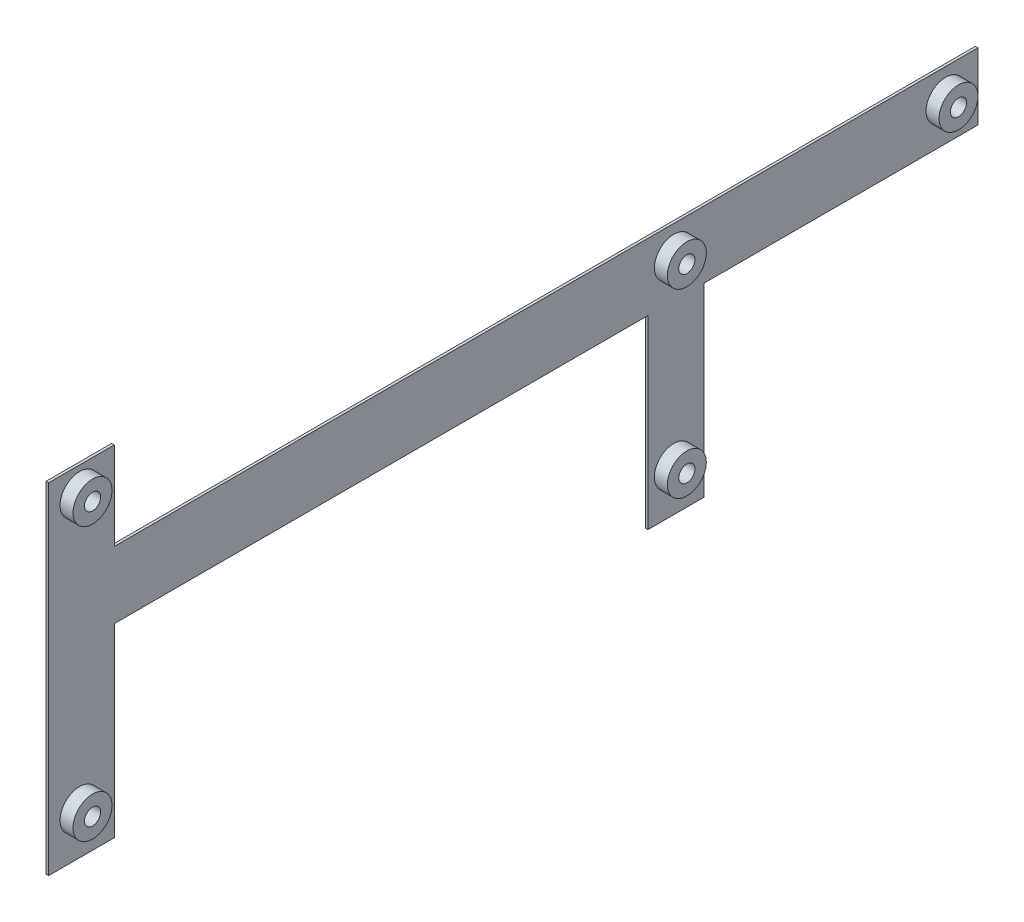
ISO-10303-21;
HEADER;
FILE_DESCRIPTION(('STEP AP214'),'2;1');
FILE_NAME('part.step','',(''),(''),'','','');
FILE_SCHEMA(('AUTOMOTIVE_DESIGN { 1 0 10303 214 1 1 1 1 }'));
ENDSEC;
DATA;
#1=APPLICATION_CONTEXT('core data for automotive mechanical design processes');
#2=APPLICATION_PROTOCOL_DEFINITION('international standard','automotive_design',2000,#1);
#3=PRODUCT_CONTEXT('',#1,'mechanical');
#4=PRODUCT('Part','Part','',(#3));
#5=PRODUCT_RELATED_PRODUCT_CATEGORY('part','',(#4));
#6=PRODUCT_DEFINITION_FORMATION('','',#4);
#7=PRODUCT_DEFINITION_CONTEXT('part definition',#1,'design');
#8=PRODUCT_DEFINITION('design','',#6,#7);
#9=PRODUCT_DEFINITION_SHAPE('','',#8);
#10=(LENGTH_UNIT() NAMED_UNIT(*) SI_UNIT(.MILLI.,.METRE.));
#11=(NAMED_UNIT(*) PLANE_ANGLE_UNIT() SI_UNIT($,.RADIAN.));
#12=(NAMED_UNIT(*) SI_UNIT($,.STERADIAN.) SOLID_ANGLE_UNIT());
#13=UNCERTAINTY_MEASURE_WITH_UNIT(LENGTH_MEASURE(1.E-05),#10,'distance_accuracy_value','');
#14=(GEOMETRIC_REPRESENTATION_CONTEXT(3) GLOBAL_UNCERTAINTY_ASSIGNED_CONTEXT((#13)) GLOBAL_UNIT_ASSIGNED_CONTEXT((#10,
#11,#12)) REPRESENTATION_CONTEXT('',''));
#15=CARTESIAN_POINT('',(0.,0.,0.));
#16=DIRECTION('',(0.,0.,1.));
#17=DIRECTION('',(1.,0.,0.));
#18=AXIS2_PLACEMENT_3D('',#15,#16,#17);
#19=CARTESIAN_POINT('',(0.,1.,163.444017334985));
#20=DIRECTION('',(0.,-1.,0.));
#21=DIRECTION('',(0.,0.,-1.));
#22=AXIS2_PLACEMENT_3D('',#19,#20,#21);
#23=PLANE('',#22);
#24=DIRECTION('',(1.,0.,0.));
#25=VECTOR('',#24,1.);
#26=CARTESIAN_POINT('',(0.,1.,163.444017334985));
#27=LINE('',#26,#25);
#28=CARTESIAN_POINT('',(0.6,1.,163.444017334985));
#29=VERTEX_POINT('',#28);
#30=CARTESIAN_POINT('',(1.,1.,163.444017334985));
#31=VERTEX_POINT('',#30);
#32=EDGE_CURVE('E166',#29,#31,#27,.T.);
#33=ORIENTED_EDGE('',*,*,#32,.F.);
#34=DIRECTION('',(0.,0.,-1.));
#35=VECTOR('',#34,1.);
#36=CARTESIAN_POINT('',(0.6,1.,163.444017334985));
#37=LINE('',#36,#35);
#38=CARTESIAN_POINT('',(0.6,1.,153.329552236333));
#39=VERTEX_POINT('',#38);
#40=EDGE_CURVE('E277',#29,#39,#37,.T.);
#41=ORIENTED_EDGE('',*,*,#40,.T.);
#42=DIRECTION('',(1.,0.,0.));
#43=VECTOR('',#42,1.);
#44=CARTESIAN_POINT('',(-9.,1.,153.329552236333));
#45=LINE('',#44,#43);
#46=CARTESIAN_POINT('',(1.,1.,153.329552236333));
#47=VERTEX_POINT('',#46);
#48=EDGE_CURVE('E163',#39,#47,#45,.T.);
#49=ORIENTED_EDGE('',*,*,#48,.T.);
#50=DIRECTION('',(0.,0.,1.));
#51=VECTOR('',#50,1.);
#52=CARTESIAN_POINT('',(1.,1.,325.));
#53=LINE('',#52,#51);
#54=EDGE_CURVE('E173',#47,#31,#53,.T.);
#55=ORIENTED_EDGE('',*,*,#54,.T.);
#56=EDGE_LOOP('',(#33,#41,#49,#55));
#57=FACE_BOUND('',#56,.T.);
#58=ADVANCED_FACE('F39',(#57),#23,.T.);
#59=CARTESIAN_POINT('',(0.,53.3864437081917,163.444017334985));
#60=DIRECTION('',(0.,0.,1.));
#61=DIRECTION('',(1.,0.,0.));
#62=AXIS2_PLACEMENT_3D('',#59,#60,#61);
#63=PLANE('',#62);
#64=DIRECTION('',(1.,0.,0.));
#65=VECTOR('',#64,1.);
#66=CARTESIAN_POINT('',(0.,53.3864437081917,163.444017334985));
#67=LINE('',#66,#65);
#68=CARTESIAN_POINT('',(0.6,53.3864437081917,163.444017334985));
#69=VERTEX_POINT('',#68);
#70=CARTESIAN_POINT('',(1.,53.3864437081917,163.444017334985));
#71=VERTEX_POINT('',#70);
#72=EDGE_CURVE('E60',#69,#71,#67,.T.);
#73=ORIENTED_EDGE('',*,*,#72,.F.);
#74=DIRECTION('',(0.,-1.,0.));
#75=VECTOR('',#74,1.);
#76=CARTESIAN_POINT('',(0.6,53.3864437081917,163.444017334985));
#77=LINE('',#76,#75);
#78=EDGE_CURVE('E272',#69,#29,#77,.T.);
#79=ORIENTED_EDGE('',*,*,#78,.T.);
#80=ORIENTED_EDGE('',*,*,#32,.T.);
#81=DIRECTION('',(0.,1.,0.));
#82=VECTOR('',#81,1.);
#83=CARTESIAN_POINT('',(1.,0.,163.444017334985));
#84=LINE('',#83,#82);
#85=EDGE_CURVE('E183',#31,#71,#84,.T.);
#86=ORIENTED_EDGE('',*,*,#85,.T.);
#87=EDGE_LOOP('',(#73,#79,#80,#86));
#88=FACE_BOUND('',#87,.T.);
#89=ADVANCED_FACE('F314',(#88),#63,.T.);
#90=CARTESIAN_POINT('',(0.,53.3864437081917,163.444017334985));
#91=DIRECTION('',(0.,1.,0.));
#92=DIRECTION('',(0.,0.,1.));
#93=AXIS2_PLACEMENT_3D('',#90,#91,#92);
#94=PLANE('',#93);
#95=DIRECTION('',(1.,0.,0.));
#96=VECTOR('',#95,1.);
#97=CARTESIAN_POINT('',(-9.,53.3864437081917,153.329552236333));
#98=LINE('',#97,#96);
#99=CARTESIAN_POINT('',(0.6,53.3864437081917,153.329552236333));
#100=VERTEX_POINT('',#99);
#101=CARTESIAN_POINT('',(1.,53.3864437081917,153.329552236333));
#102=VERTEX_POINT('',#101);
#103=EDGE_CURVE('E145',#100,#102,#98,.T.);
#104=ORIENTED_EDGE('',*,*,#103,.F.);
#105=DIRECTION('',(0.,0.,1.));
#106=VECTOR('',#105,1.);
#107=CARTESIAN_POINT('',(0.6,53.3864437081917,163.444017334985));
#108=LINE('',#107,#106);
#109=EDGE_CURVE('E53',#100,#69,#108,.T.);
#110=ORIENTED_EDGE('',*,*,#109,.T.);
#111=ORIENTED_EDGE('',*,*,#72,.T.);
#112=DIRECTION('',(0.,0.,-1.));
#113=VECTOR('',#112,1.);
#114=CARTESIAN_POINT('',(1.,53.3864437081917,325.));
#115=LINE('',#114,#113);
#116=EDGE_CURVE('E181',#71,#102,#115,.T.);
#117=ORIENTED_EDGE('',*,*,#116,.T.);
#118=EDGE_LOOP('',(#104,#110,#111,#117));
#119=FACE_BOUND('',#118,.T.);
#120=ADVANCED_FACE('F316',(#119),#94,.T.);
#121=CARTESIAN_POINT('',(0.,53.3864437081917,20.3685065016627));
#122=DIRECTION('',(0.,0.,-1.));
#123=DIRECTION('',(-1.,0.,0.));
#124=AXIS2_PLACEMENT_3D('',#121,#122,#123);
#125=PLANE('',#124);
#126=DIRECTION('',(1.,0.,0.));
#127=VECTOR('',#126,1.);
#128=CARTESIAN_POINT('',(-9.,29.5458737606863,20.3685065016627));
#129=LINE('',#128,#127);
#130=CARTESIAN_POINT('',(0.6,29.5458737606863,20.3685065016627));
#131=VERTEX_POINT('',#130);
#132=CARTESIAN_POINT('',(1.,29.5458737606863,20.3685065016627));
#133=VERTEX_POINT('',#132);
#134=EDGE_CURVE('E260',#131,#133,#129,.T.);
#135=ORIENTED_EDGE('',*,*,#134,.F.);
#136=DIRECTION('',(0.,1.,0.));
#137=VECTOR('',#136,1.);
#138=CARTESIAN_POINT('',(0.6,53.3864437081917,20.3685065016627));
#139=LINE('',#138,#137);
#140=CARTESIAN_POINT('',(0.6,39.8466740003524,20.3685065016627));
#141=VERTEX_POINT('',#140);
#142=EDGE_CURVE('E139',#131,#141,#139,.T.);
#143=ORIENTED_EDGE('',*,*,#142,.T.);
#144=DIRECTION('',(1.,0.,0.));
#145=VECTOR('',#144,1.);
#146=CARTESIAN_POINT('',(-9.,39.8466740003524,20.3685065016627));
#147=LINE('',#146,#145);
#148=CARTESIAN_POINT('',(1.,39.8466740003524,20.3685065016627));
#149=VERTEX_POINT('',#148);
#150=EDGE_CURVE('E138',#141,#149,#147,.T.);
#151=ORIENTED_EDGE('',*,*,#150,.T.);
#152=DIRECTION('',(0.,-1.,0.));
#153=VECTOR('',#152,1.);
#154=CARTESIAN_POINT('',(1.,0.,20.3685065016627));
#155=LINE('',#154,#153);
#156=EDGE_CURVE('E178',#149,#133,#155,.T.);
#157=ORIENTED_EDGE('',*,*,#156,.T.);
#158=EDGE_LOOP('',(#135,#143,#151,#157));
#159=FACE_BOUND('',#158,.T.);
#160=ADVANCED_FACE('F269',(#159),#125,.T.);
#161=DIRECTION('',(1.,0.,0.));
#162=VECTOR('',#161,1.);
#163=CARTESIAN_POINT('',(-9.,1.,71.1774910656624));
#164=LINE('',#163,#162);
#165=CARTESIAN_POINT('',(0.6,1.,71.1774910656624));
#166=VERTEX_POINT('',#165);
#167=CARTESIAN_POINT('',(1.,1.,71.1774910656624));
#168=VERTEX_POINT('',#167);
#169=EDGE_CURVE('E169',#166,#168,#164,.T.);
#170=ORIENTED_EDGE('',*,*,#169,.F.);
#171=DIRECTION('',(0.,0.,-1.));
#172=VECTOR('',#171,1.);
#173=CARTESIAN_POINT('',(0.6,1.,163.444017334985));
#174=LINE('',#173,#172);
#175=CARTESIAN_POINT('',(0.6,1.,62.529905679276));
#176=VERTEX_POINT('',#175);
#177=EDGE_CURVE('E226',#166,#176,#174,.T.);
#178=ORIENTED_EDGE('',*,*,#177,.T.);
#179=DIRECTION('',(1.,0.,0.));
#180=VECTOR('',#179,1.);
#181=CARTESIAN_POINT('',(-9.,1.,62.529905679276));
#182=LINE('',#181,#180);
#183=CARTESIAN_POINT('',(1.,1.,62.529905679276));
#184=VERTEX_POINT('',#183);
#185=EDGE_CURVE('E258',#176,#184,#182,.T.);
#186=ORIENTED_EDGE('',*,*,#185,.T.);
#187=EDGE_CURVE('E177',#184,#168,#53,.T.);
#188=ORIENTED_EDGE('',*,*,#187,.T.);
#189=EDGE_LOOP('',(#170,#178,#186,#188));
#190=FACE_BOUND('',#189,.T.);
#191=ADVANCED_FACE('F289',(#190),#23,.T.);
#192=CARTESIAN_POINT('',(-9.,1.,153.329552236333));
#193=DIRECTION('',(0.,0.,1.));
#194=DIRECTION('',(1.,0.,0.));
#195=AXIS2_PLACEMENT_3D('',#192,#193,#194);
#196=PLANE('',#195);
#197=DIRECTION('',(0.,-1.,0.));
#198=VECTOR('',#197,1.);
#199=CARTESIAN_POINT('',(0.6,1.,153.329552236333));
#200=LINE('',#199,#198);
#201=CARTESIAN_POINT('',(0.6,29.5458737606863,153.329552236333));
#202=VERTEX_POINT('',#201);
#203=EDGE_CURVE('E284',#202,#39,#200,.T.);
#204=ORIENTED_EDGE('',*,*,#203,.F.);
#205=DIRECTION('',(1.,0.,0.));
#206=VECTOR('',#205,1.);
#207=CARTESIAN_POINT('',(-9.,29.5458737606863,153.329552236333));
#208=LINE('',#207,#206);
#209=CARTESIAN_POINT('',(1.,29.5458737606863,153.329552236333));
#210=VERTEX_POINT('',#209);
#211=EDGE_CURVE('E164',#202,#210,#208,.T.);
#212=ORIENTED_EDGE('',*,*,#211,.T.);
#213=DIRECTION('',(0.,-1.,0.));
#214=VECTOR('',#213,1.);
#215=CARTESIAN_POINT('',(1.,1.,153.329552236333));
#216=LINE('',#215,#214);
#217=EDGE_CURVE('E153',#210,#47,#216,.T.);
#218=ORIENTED_EDGE('',*,*,#217,.T.);
#219=ORIENTED_EDGE('',*,*,#48,.F.);
#220=EDGE_LOOP('',(#204,#212,#218,#219));
#221=FACE_BOUND('',#220,.T.);
#222=ADVANCED_FACE('F307',(#221),#196,.F.);
#223=CARTESIAN_POINT('',(-9.,29.5458737606863,153.329552236333));
#224=DIRECTION('',(0.,1.,0.));
#225=DIRECTION('',(0.,0.,1.));
#226=AXIS2_PLACEMENT_3D('',#223,#224,#225);
#227=PLANE('',#226);
#228=DIRECTION('',(0.,0.,1.));
#229=VECTOR('',#228,1.);
#230=CARTESIAN_POINT('',(0.6,29.5458737606863,153.329552236333));
#231=LINE('',#230,#229);
#232=CARTESIAN_POINT('',(0.6,29.5458737606863,71.1774910656624));
#233=VERTEX_POINT('',#232);
#234=EDGE_CURVE('E216',#233,#202,#231,.T.);
#235=ORIENTED_EDGE('',*,*,#234,.F.);
#236=DIRECTION('',(1.,0.,0.));
#237=VECTOR('',#236,1.);
#238=CARTESIAN_POINT('',(-9.,29.5458737606863,71.1774910656624));
#239=LINE('',#238,#237);
#240=CARTESIAN_POINT('',(1.,29.5458737606863,71.1774910656624));
#241=VERTEX_POINT('',#240);
#242=EDGE_CURVE('E167',#233,#241,#239,.T.);
#243=ORIENTED_EDGE('',*,*,#242,.T.);
#244=DIRECTION('',(0.,0.,1.));
#245=VECTOR('',#244,1.);
#246=CARTESIAN_POINT('',(1.,29.5458737606863,153.329552236333));
#247=LINE('',#246,#245);
#248=EDGE_CURVE('E160',#241,#210,#247,.T.);
#249=ORIENTED_EDGE('',*,*,#248,.T.);
#250=ORIENTED_EDGE('',*,*,#211,.F.);
#251=EDGE_LOOP('',(#235,#243,#249,#250));
#252=FACE_BOUND('',#251,.T.);
#253=ADVANCED_FACE('F305',(#252),#227,.F.);
#254=CARTESIAN_POINT('',(-9.,1.,71.1774910656624));
#255=DIRECTION('',(0.,0.,-1.));
#256=DIRECTION('',(-1.,0.,0.));
#257=AXIS2_PLACEMENT_3D('',#254,#255,#256);
#258=PLANE('',#257);
#259=DIRECTION('',(0.,1.,0.));
#260=VECTOR('',#259,1.);
#261=CARTESIAN_POINT('',(0.6,1.,71.1774910656624));
#262=LINE('',#261,#260);
#263=EDGE_CURVE('E222',#166,#233,#262,.T.);
#264=ORIENTED_EDGE('',*,*,#263,.F.);
#265=ORIENTED_EDGE('',*,*,#169,.T.);
#266=DIRECTION('',(0.,1.,0.));
#267=VECTOR('',#266,1.);
#268=CARTESIAN_POINT('',(1.,1.,71.1774910656624));
#269=LINE('',#268,#267);
#270=EDGE_CURVE('E156',#168,#241,#269,.T.);
#271=ORIENTED_EDGE('',*,*,#270,.T.);
#272=ORIENTED_EDGE('',*,*,#242,.F.);
#273=EDGE_LOOP('',(#264,#265,#271,#272));
#274=FACE_BOUND('',#273,.T.);
#275=ADVANCED_FACE('F302',(#274),#258,.F.);
#276=CARTESIAN_POINT('',(-9.,1.,62.529905679276));
#277=DIRECTION('',(0.,0.,1.));
#278=DIRECTION('',(1.,0.,0.));
#279=AXIS2_PLACEMENT_3D('',#276,#277,#278);
#280=PLANE('',#279);
#281=DIRECTION('',(0.,-1.,0.));
#282=VECTOR('',#281,1.);
#283=CARTESIAN_POINT('',(0.6,1.,62.529905679276));
#284=LINE('',#283,#282);
#285=CARTESIAN_POINT('',(0.6,29.5458737606863,62.529905679276));
#286=VERTEX_POINT('',#285);
#287=EDGE_CURVE('E282',#286,#176,#284,.T.);
#288=ORIENTED_EDGE('',*,*,#287,.F.);
#289=DIRECTION('',(1.,0.,0.));
#290=VECTOR('',#289,1.);
#291=CARTESIAN_POINT('',(-9.,29.5458737606863,62.529905679276));
#292=LINE('',#291,#290);
#293=CARTESIAN_POINT('',(1.,29.5458737606863,62.529905679276));
#294=VERTEX_POINT('',#293);
#295=EDGE_CURVE('E157',#286,#294,#292,.T.);
#296=ORIENTED_EDGE('',*,*,#295,.T.);
#297=DIRECTION('',(0.,-1.,0.));
#298=VECTOR('',#297,1.);
#299=CARTESIAN_POINT('',(1.,1.,62.529905679276));
#300=LINE('',#299,#298);
#301=EDGE_CURVE('E147',#294,#184,#300,.T.);
#302=ORIENTED_EDGE('',*,*,#301,.T.);
#303=ORIENTED_EDGE('',*,*,#185,.F.);
#304=EDGE_LOOP('',(#288,#296,#302,#303));
#305=FACE_BOUND('',#304,.T.);
#306=ADVANCED_FACE('F294',(#305),#280,.F.);
#307=CARTESIAN_POINT('',(-9.,29.5458737606863,62.529905679276));
#308=DIRECTION('',(0.,1.,0.));
#309=DIRECTION('',(0.,0.,1.));
#310=AXIS2_PLACEMENT_3D('',#307,#308,#309);
#311=PLANE('',#310);
#312=DIRECTION('',(0.,0.,1.));
#313=VECTOR('',#312,1.);
#314=CARTESIAN_POINT('',(0.6,29.5458737606863,62.529905679276));
#315=LINE('',#314,#313);
#316=EDGE_CURVE('E280',#131,#286,#315,.T.);
#317=ORIENTED_EDGE('',*,*,#316,.F.);
#318=ORIENTED_EDGE('',*,*,#134,.T.);
#319=DIRECTION('',(0.,0.,1.));
#320=VECTOR('',#319,1.);
#321=CARTESIAN_POINT('',(1.,29.5458737606863,62.529905679276));
#322=LINE('',#321,#320);
#323=EDGE_CURVE('E255',#133,#294,#322,.T.);
#324=ORIENTED_EDGE('',*,*,#323,.T.);
#325=ORIENTED_EDGE('',*,*,#295,.F.);
#326=EDGE_LOOP('',(#317,#318,#324,#325));
#327=FACE_BOUND('',#326,.T.);
#328=ADVANCED_FACE('F347',(#327),#311,.F.);
#329=CARTESIAN_POINT('',(-9.,39.8466740003524,20.3685065016627));
#330=DIRECTION('',(0.,-1.,0.));
#331=DIRECTION('',(0.,0.,-1.));
#332=AXIS2_PLACEMENT_3D('',#329,#330,#331);
#333=PLANE('',#332);
#334=DIRECTION('',(0.,0.,-1.));
#335=VECTOR('',#334,1.);
#336=CARTESIAN_POINT('',(0.6,39.8466740003524,20.3685065016627));
#337=LINE('',#336,#335);
#338=CARTESIAN_POINT('',(0.6,39.8466740003524,153.329552236333));
#339=VERTEX_POINT('',#338);
#340=EDGE_CURVE('E127',#339,#141,#337,.T.);
#341=ORIENTED_EDGE('',*,*,#340,.F.);
#342=DIRECTION('',(1.,0.,0.));
#343=VECTOR('',#342,1.);
#344=CARTESIAN_POINT('',(-9.,39.8466740003524,153.329552236333));
#345=LINE('',#344,#343);
#346=CARTESIAN_POINT('',(1.,39.8466740003524,153.329552236333));
#347=VERTEX_POINT('',#346);
#348=EDGE_CURVE('E136',#339,#347,#345,.T.);
#349=ORIENTED_EDGE('',*,*,#348,.T.);
#350=DIRECTION('',(0.,0.,-1.));
#351=VECTOR('',#350,1.);
#352=CARTESIAN_POINT('',(1.,39.8466740003524,20.3685065016627));
#353=LINE('',#352,#351);
#354=EDGE_CURVE('E149',#347,#149,#353,.T.);
#355=ORIENTED_EDGE('',*,*,#354,.T.);
#356=ORIENTED_EDGE('',*,*,#150,.F.);
#357=EDGE_LOOP('',(#341,#349,#355,#356));
#358=FACE_BOUND('',#357,.T.);
#359=ADVANCED_FACE('F134',(#358),#333,.F.);
#360=CARTESIAN_POINT('',(-9.,53.3864437081917,153.329552236333));
#361=DIRECTION('',(0.,0.,1.));
#362=DIRECTION('',(1.,0.,0.));
#363=AXIS2_PLACEMENT_3D('',#360,#361,#362);
#364=PLANE('',#363);
#365=DIRECTION('',(0.,-1.,0.));
#366=VECTOR('',#365,1.);
#367=CARTESIAN_POINT('',(0.6,53.3864437081917,153.329552236333));
#368=LINE('',#367,#366);
#369=EDGE_CURVE('E11',#100,#339,#368,.T.);
#370=ORIENTED_EDGE('',*,*,#369,.F.);
#371=ORIENTED_EDGE('',*,*,#103,.T.);
#372=DIRECTION('',(0.,-1.,0.));
#373=VECTOR('',#372,1.);
#374=CARTESIAN_POINT('',(1.,53.3864437081917,153.329552236333));
#375=LINE('',#374,#373);
#376=EDGE_CURVE('E143',#102,#347,#375,.T.);
#377=ORIENTED_EDGE('',*,*,#376,.T.);
#378=ORIENTED_EDGE('',*,*,#348,.F.);
#379=EDGE_LOOP('',(#370,#371,#377,#378));
#380=FACE_BOUND('',#379,.T.);
#381=ADVANCED_FACE('F141',(#380),#364,.F.);
#382=CARTESIAN_POINT('',(7.,49.5,158.678883656557));
#383=DIRECTION('',(-1.,0.,0.));
#384=DIRECTION('',(0.,0.,1.));
#385=AXIS2_PLACEMENT_3D('',#382,#383,#384);
#386=CYLINDRICAL_SURFACE('',#385,2.99999999999999);
#387=CARTESIAN_POINT('',(1.,49.5,158.678883656557));
#388=DIRECTION('',(-1.,0.,0.));
#389=DIRECTION('',(0.,0.,1.));
#390=AXIS2_PLACEMENT_3D('',#387,#388,#389);
#391=CIRCLE('',#390,2.99999999999999);
#392=CARTESIAN_POINT('',(1.,49.5,161.678883656557));
#393=VERTEX_POINT('',#392);
#394=EDGE_CURVE('E200',#393,#393,#391,.F.);
#395=ORIENTED_EDGE('',*,*,#394,.T.);
#396=EDGE_LOOP('',(#395));
#397=FACE_BOUND('',#396,.T.);
#398=CARTESIAN_POINT('',(3.,49.5,158.678883656557));
#399=DIRECTION('',(1.,0.,0.));
#400=DIRECTION('',(0.,0.,-1.));
#401=AXIS2_PLACEMENT_3D('',#398,#399,#400);
#402=CIRCLE('',#401,2.99999999999999);
#403=CARTESIAN_POINT('',(3.,49.5,155.678883656557));
#404=VERTEX_POINT('',#403);
#405=EDGE_CURVE('E250',#404,#404,#402,.T.);
#406=ORIENTED_EDGE('',*,*,#405,.F.);
#407=EDGE_LOOP('',(#406));
#408=FACE_BOUND('',#407,.T.);
#409=ADVANCED_FACE('F344',(#397,#408),#386,.T.);
#410=CARTESIAN_POINT('',(7.,7.5,158.678883656557));
#411=DIRECTION('',(-1.,0.,0.));
#412=DIRECTION('',(0.,0.,1.));
#413=AXIS2_PLACEMENT_3D('',#410,#411,#412);
#414=CYLINDRICAL_SURFACE('',#413,2.99999999999999);
#415=CARTESIAN_POINT('',(1.,7.5,158.678883656557));
#416=DIRECTION('',(-1.,0.,0.));
#417=DIRECTION('',(0.,0.,1.));
#418=AXIS2_PLACEMENT_3D('',#415,#416,#417);
#419=CIRCLE('',#418,2.99999999999999);
#420=CARTESIAN_POINT('',(1.,7.5,161.678883656557));
#421=VERTEX_POINT('',#420);
#422=EDGE_CURVE('E203',#421,#421,#419,.F.);
#423=ORIENTED_EDGE('',*,*,#422,.T.);
#424=EDGE_LOOP('',(#423));
#425=FACE_BOUND('',#424,.T.);
#426=CARTESIAN_POINT('',(3.,7.5,158.678883656557));
#427=DIRECTION('',(1.,0.,0.));
#428=DIRECTION('',(0.,0.,-1.));
#429=AXIS2_PLACEMENT_3D('',#426,#427,#428);
#430=CIRCLE('',#429,2.99999999999999);
#431=CARTESIAN_POINT('',(3.,7.5,155.678883656557));
#432=VERTEX_POINT('',#431);
#433=EDGE_CURVE('E244',#432,#432,#430,.T.);
#434=ORIENTED_EDGE('',*,*,#433,.F.);
#435=EDGE_LOOP('',(#434));
#436=FACE_BOUND('',#435,.T.);
#437=ADVANCED_FACE('F377',(#425,#436),#414,.T.);
#438=CARTESIAN_POINT('',(7.,7.5,67.1788836565571));
#439=DIRECTION('',(-1.,0.,0.));
#440=DIRECTION('',(0.,0.,1.));
#441=AXIS2_PLACEMENT_3D('',#438,#439,#440);
#442=CYLINDRICAL_SURFACE('',#441,3.00000000000001);
#443=CARTESIAN_POINT('',(1.,7.5,67.1788836565571));
#444=DIRECTION('',(-1.,0.,0.));
#445=DIRECTION('',(0.,0.,1.));
#446=AXIS2_PLACEMENT_3D('',#443,#444,#445);
#447=CIRCLE('',#446,3.00000000000001);
#448=CARTESIAN_POINT('',(1.,7.5,70.1788836565571));
#449=VERTEX_POINT('',#448);
#450=EDGE_CURVE('E206',#449,#449,#447,.F.);
#451=ORIENTED_EDGE('',*,*,#450,.T.);
#452=EDGE_LOOP('',(#451));
#453=FACE_BOUND('',#452,.T.);
#454=CARTESIAN_POINT('',(3.,7.5,67.1788836565571));
#455=DIRECTION('',(1.,0.,0.));
#456=DIRECTION('',(0.,0.,-1.));
#457=AXIS2_PLACEMENT_3D('',#454,#455,#456);
#458=CIRCLE('',#457,3.00000000000001);
#459=CARTESIAN_POINT('',(3.,7.5,64.1788836565571));
#460=VERTEX_POINT('',#459);
#461=EDGE_CURVE('E238',#460,#460,#458,.T.);
#462=ORIENTED_EDGE('',*,*,#461,.F.);
#463=EDGE_LOOP('',(#462));
#464=FACE_BOUND('',#463,.T.);
#465=ADVANCED_FACE('F385',(#453,#464),#442,.T.);
#466=CARTESIAN_POINT('',(7.,35.4,67.1788836565571));
#467=DIRECTION('',(-1.,0.,0.));
#468=DIRECTION('',(0.,0.,1.));
#469=AXIS2_PLACEMENT_3D('',#466,#467,#468);
#470=CYLINDRICAL_SURFACE('',#469,3.00000000000001);
#471=CARTESIAN_POINT('',(1.,35.4,67.1788836565571));
#472=DIRECTION('',(-1.,0.,0.));
#473=DIRECTION('',(0.,0.,1.));
#474=AXIS2_PLACEMENT_3D('',#471,#472,#473);
#475=CIRCLE('',#474,3.00000000000001);
#476=CARTESIAN_POINT('',(1.,35.4,70.1788836565571));
#477=VERTEX_POINT('',#476);
#478=EDGE_CURVE('E209',#477,#477,#475,.F.);
#479=ORIENTED_EDGE('',*,*,#478,.T.);
#480=EDGE_LOOP('',(#479));
#481=FACE_BOUND('',#480,.T.);
#482=CARTESIAN_POINT('',(3.,35.4,67.1788836565571));
#483=DIRECTION('',(1.,0.,0.));
#484=DIRECTION('',(0.,0.,-1.));
#485=AXIS2_PLACEMENT_3D('',#482,#483,#484);
#486=CIRCLE('',#485,3.00000000000001);
#487=CARTESIAN_POINT('',(3.,35.4,64.1788836565571));
#488=VERTEX_POINT('',#487);
#489=EDGE_CURVE('E232',#488,#488,#486,.T.);
#490=ORIENTED_EDGE('',*,*,#489,.F.);
#491=EDGE_LOOP('',(#490));
#492=FACE_BOUND('',#491,.T.);
#493=ADVANCED_FACE('F400',(#481,#492),#470,.T.);
#494=CARTESIAN_POINT('',(7.,35.4,25.3507810593582));
#495=DIRECTION('',(-1.,0.,0.));
#496=DIRECTION('',(0.,0.,1.));
#497=AXIS2_PLACEMENT_3D('',#494,#495,#496);
#498=CYLINDRICAL_SURFACE('',#497,3.);
#499=CARTESIAN_POINT('',(1.,35.4,25.3507810593582));
#500=DIRECTION('',(-1.,0.,0.));
#501=DIRECTION('',(0.,0.,1.));
#502=AXIS2_PLACEMENT_3D('',#499,#500,#501);
#503=CIRCLE('',#502,3.);
#504=CARTESIAN_POINT('',(1.,35.4,28.3507810593582));
#505=VERTEX_POINT('',#504);
#506=EDGE_CURVE('E47',#505,#505,#503,.F.);
#507=ORIENTED_EDGE('',*,*,#506,.T.);
#508=EDGE_LOOP('',(#507));
#509=FACE_BOUND('',#508,.T.);
#510=CARTESIAN_POINT('',(3.,35.4,25.3507810593582));
#511=DIRECTION('',(1.,0.,0.));
#512=DIRECTION('',(0.,0.,-1.));
#513=AXIS2_PLACEMENT_3D('',#510,#511,#512);
#514=CIRCLE('',#513,3.);
#515=CARTESIAN_POINT('',(3.,35.4,22.3507810593582));
#516=VERTEX_POINT('',#515);
#517=EDGE_CURVE('E215',#516,#516,#514,.T.);
#518=ORIENTED_EDGE('',*,*,#517,.F.);
#519=EDGE_LOOP('',(#518));
#520=FACE_BOUND('',#519,.T.);
#521=ADVANCED_FACE('F393',(#509,#520),#498,.T.);
#522=CARTESIAN_POINT('',(1.,0.,325.));
#523=DIRECTION('',(-1.,0.,0.));
#524=DIRECTION('',(0.,0.,1.));
#525=AXIS2_PLACEMENT_3D('',#522,#523,#524);
#526=PLANE('',#525);
#527=ORIENTED_EDGE('',*,*,#506,.F.);
#528=EDGE_LOOP('',(#527));
#529=FACE_BOUND('',#528,.T.);
#530=ORIENTED_EDGE('',*,*,#478,.F.);
#531=EDGE_LOOP('',(#530));
#532=FACE_BOUND('',#531,.T.);
#533=ORIENTED_EDGE('',*,*,#450,.F.);
#534=EDGE_LOOP('',(#533));
#535=FACE_BOUND('',#534,.T.);
#536=ORIENTED_EDGE('',*,*,#422,.F.);
#537=EDGE_LOOP('',(#536));
#538=FACE_BOUND('',#537,.T.);
#539=ORIENTED_EDGE('',*,*,#394,.F.);
#540=EDGE_LOOP('',(#539));
#541=FACE_BOUND('',#540,.T.);
#542=ORIENTED_EDGE('',*,*,#156,.F.);
#543=ORIENTED_EDGE('',*,*,#354,.F.);
#544=ORIENTED_EDGE('',*,*,#376,.F.);
#545=ORIENTED_EDGE('',*,*,#116,.F.);
#546=ORIENTED_EDGE('',*,*,#85,.F.);
#547=ORIENTED_EDGE('',*,*,#54,.F.);
#548=ORIENTED_EDGE('',*,*,#217,.F.);
#549=ORIENTED_EDGE('',*,*,#248,.F.);
#550=ORIENTED_EDGE('',*,*,#270,.F.);
#551=ORIENTED_EDGE('',*,*,#187,.F.);
#552=ORIENTED_EDGE('',*,*,#301,.F.);
#553=ORIENTED_EDGE('',*,*,#323,.F.);
#554=EDGE_LOOP('',(#542,#543,#544,#545,#546,#547,#548,#549,#550,#551,#552,#553));
#555=FACE_BOUND('',#554,.T.);
#556=ADVANCED_FACE('F41',(#529,#532,#535,#538,#541,#555),#526,.F.);
#557=CARTESIAN_POINT('',(3.,0.,0.));
#558=DIRECTION('',(1.,0.,0.));
#559=DIRECTION('',(0.,0.,-1.));
#560=AXIS2_PLACEMENT_3D('',#557,#558,#559);
#561=PLANE('',#560);
#562=CARTESIAN_POINT('',(3.,35.4,25.3507810593582));
#563=DIRECTION('',(1.,0.,0.));
#564=DIRECTION('',(0.,0.,-1.));
#565=AXIS2_PLACEMENT_3D('',#562,#563,#564);
#566=CIRCLE('',#565,1.25);
#567=CARTESIAN_POINT('',(3.,35.4,24.1007810593582));
#568=VERTEX_POINT('',#567);
#569=EDGE_CURVE('E213',#568,#568,#566,.T.);
#570=ORIENTED_EDGE('',*,*,#569,.F.);
#571=EDGE_LOOP('',(#570));
#572=FACE_BOUND('',#571,.T.);
#573=ORIENTED_EDGE('',*,*,#517,.T.);
#574=EDGE_LOOP('',(#573));
#575=FACE_BOUND('',#574,.T.);
#576=ADVANCED_FACE('F359',(#572,#575),#561,.T.);
#577=CARTESIAN_POINT('',(3.,35.4,67.1788836565571));
#578=DIRECTION('',(1.,0.,0.));
#579=DIRECTION('',(0.,0.,-1.));
#580=AXIS2_PLACEMENT_3D('',#577,#578,#579);
#581=CIRCLE('',#580,1.25);
#582=CARTESIAN_POINT('',(3.,35.4,65.9288836565571));
#583=VERTEX_POINT('',#582);
#584=EDGE_CURVE('E220',#583,#583,#581,.T.);
#585=ORIENTED_EDGE('',*,*,#584,.F.);
#586=EDGE_LOOP('',(#585));
#587=FACE_BOUND('',#586,.T.);
#588=ORIENTED_EDGE('',*,*,#489,.T.);
#589=EDGE_LOOP('',(#588));
#590=FACE_BOUND('',#589,.T.);
#591=ADVANCED_FACE('F397',(#587,#590),#561,.T.);
#592=CARTESIAN_POINT('',(3.,7.5,67.1788836565571));
#593=DIRECTION('',(1.,0.,0.));
#594=DIRECTION('',(0.,0.,-1.));
#595=AXIS2_PLACEMENT_3D('',#592,#593,#594);
#596=CIRCLE('',#595,1.25);
#597=CARTESIAN_POINT('',(3.,7.5,65.9288836565571));
#598=VERTEX_POINT('',#597);
#599=EDGE_CURVE('E235',#598,#598,#596,.T.);
#600=ORIENTED_EDGE('',*,*,#599,.F.);
#601=EDGE_LOOP('',(#600));
#602=FACE_BOUND('',#601,.T.);
#603=ORIENTED_EDGE('',*,*,#461,.T.);
#604=EDGE_LOOP('',(#603));
#605=FACE_BOUND('',#604,.T.);
#606=ADVANCED_FACE('F443',(#602,#605),#561,.T.);
#607=CARTESIAN_POINT('',(3.,7.5,158.678883656557));
#608=DIRECTION('',(1.,0.,0.));
#609=DIRECTION('',(0.,0.,-1.));
#610=AXIS2_PLACEMENT_3D('',#607,#608,#609);
#611=CIRCLE('',#610,1.25000000000001);
#612=CARTESIAN_POINT('',(3.,7.5,157.428883656557));
#613=VERTEX_POINT('',#612);
#614=EDGE_CURVE('E241',#613,#613,#611,.T.);
#615=ORIENTED_EDGE('',*,*,#614,.F.);
#616=EDGE_LOOP('',(#615));
#617=FACE_BOUND('',#616,.T.);
#618=ORIENTED_EDGE('',*,*,#433,.T.);
#619=EDGE_LOOP('',(#618));
#620=FACE_BOUND('',#619,.T.);
#621=ADVANCED_FACE('F357',(#617,#620),#561,.T.);
#622=CARTESIAN_POINT('',(3.,49.5,158.678883656557));
#623=DIRECTION('',(1.,0.,0.));
#624=DIRECTION('',(0.,0.,-1.));
#625=AXIS2_PLACEMENT_3D('',#622,#623,#624);
#626=CIRCLE('',#625,1.25000000000001);
#627=CARTESIAN_POINT('',(3.,49.5,157.428883656557));
#628=VERTEX_POINT('',#627);
#629=EDGE_CURVE('E247',#628,#628,#626,.T.);
#630=ORIENTED_EDGE('',*,*,#629,.F.);
#631=EDGE_LOOP('',(#630));
#632=FACE_BOUND('',#631,.T.);
#633=ORIENTED_EDGE('',*,*,#405,.T.);
#634=EDGE_LOOP('',(#633));
#635=FACE_BOUND('',#634,.T.);
#636=ADVANCED_FACE('F353',(#632,#635),#561,.T.);
#637=CARTESIAN_POINT('',(1.,35.4,25.3507810593582));
#638=DIRECTION('',(1.,0.,0.));
#639=DIRECTION('',(0.,0.,-1.));
#640=AXIS2_PLACEMENT_3D('',#637,#638,#639);
#641=CIRCLE('',#640,1.25);
#642=CARTESIAN_POINT('',(1.,35.4,24.1007810593582));
#643=VERTEX_POINT('',#642);
#644=EDGE_CURVE('E185',#643,#643,#641,.T.);
#645=ORIENTED_EDGE('',*,*,#644,.T.);
#646=EDGE_LOOP('',(#645));
#647=FACE_BOUND('',#646,.T.);
#648=ADVANCED_FACE('F356',(#647),#526,.F.);
#649=CARTESIAN_POINT('',(7.,35.4,25.3507810593582));
#650=DIRECTION('',(-1.,0.,0.));
#651=DIRECTION('',(0.,0.,1.));
#652=AXIS2_PLACEMENT_3D('',#649,#650,#651);
#653=CYLINDRICAL_SURFACE('',#652,1.25);
#654=ORIENTED_EDGE('',*,*,#644,.F.);
#655=EDGE_LOOP('',(#654));
#656=FACE_BOUND('',#655,.T.);
#657=ORIENTED_EDGE('',*,*,#569,.T.);
#658=EDGE_LOOP('',(#657));
#659=FACE_BOUND('',#658,.T.);
#660=ADVANCED_FACE('F406',(#656,#659),#653,.F.);
#661=CARTESIAN_POINT('',(1.,35.4,67.1788836565571));
#662=DIRECTION('',(1.,0.,0.));
#663=DIRECTION('',(0.,0.,-1.));
#664=AXIS2_PLACEMENT_3D('',#661,#662,#663);
#665=CIRCLE('',#664,1.25);
#666=CARTESIAN_POINT('',(1.,35.4,65.9288836565571));
#667=VERTEX_POINT('',#666);
#668=EDGE_CURVE('E188',#667,#667,#665,.T.);
#669=ORIENTED_EDGE('',*,*,#668,.T.);
#670=EDGE_LOOP('',(#669));
#671=FACE_BOUND('',#670,.T.);
#672=ADVANCED_FACE('F408',(#671),#526,.F.);
#673=CARTESIAN_POINT('',(7.,35.4,67.1788836565571));
#674=DIRECTION('',(-1.,0.,0.));
#675=DIRECTION('',(0.,0.,1.));
#676=AXIS2_PLACEMENT_3D('',#673,#674,#675);
#677=CYLINDRICAL_SURFACE('',#676,1.25);
#678=ORIENTED_EDGE('',*,*,#668,.F.);
#679=EDGE_LOOP('',(#678));
#680=FACE_BOUND('',#679,.T.);
#681=ORIENTED_EDGE('',*,*,#584,.T.);
#682=EDGE_LOOP('',(#681));
#683=FACE_BOUND('',#682,.T.);
#684=ADVANCED_FACE('F416',(#680,#683),#677,.F.);
#685=CARTESIAN_POINT('',(1.,7.5,67.1788836565571));
#686=DIRECTION('',(1.,0.,0.));
#687=DIRECTION('',(0.,0.,-1.));
#688=AXIS2_PLACEMENT_3D('',#685,#686,#687);
#689=CIRCLE('',#688,1.25);
#690=CARTESIAN_POINT('',(1.,7.5,65.9288836565571));
#691=VERTEX_POINT('',#690);
#692=EDGE_CURVE('E191',#691,#691,#689,.T.);
#693=ORIENTED_EDGE('',*,*,#692,.T.);
#694=EDGE_LOOP('',(#693));
#695=FACE_BOUND('',#694,.T.);
#696=ADVANCED_FACE('F418',(#695),#526,.F.);
#697=CARTESIAN_POINT('',(7.,7.5,67.1788836565571));
#698=DIRECTION('',(-1.,0.,0.));
#699=DIRECTION('',(0.,0.,1.));
#700=AXIS2_PLACEMENT_3D('',#697,#698,#699);
#701=CYLINDRICAL_SURFACE('',#700,1.25);
#702=ORIENTED_EDGE('',*,*,#692,.F.);
#703=EDGE_LOOP('',(#702));
#704=FACE_BOUND('',#703,.T.);
#705=ORIENTED_EDGE('',*,*,#599,.T.);
#706=EDGE_LOOP('',(#705));
#707=FACE_BOUND('',#706,.T.);
#708=ADVANCED_FACE('F425',(#704,#707),#701,.F.);
#709=CARTESIAN_POINT('',(1.,7.5,158.678883656557));
#710=DIRECTION('',(1.,0.,0.));
#711=DIRECTION('',(0.,0.,-1.));
#712=AXIS2_PLACEMENT_3D('',#709,#710,#711);
#713=CIRCLE('',#712,1.25000000000001);
#714=CARTESIAN_POINT('',(1.,7.5,157.428883656557));
#715=VERTEX_POINT('',#714);
#716=EDGE_CURVE('E194',#715,#715,#713,.T.);
#717=ORIENTED_EDGE('',*,*,#716,.T.);
#718=EDGE_LOOP('',(#717));
#719=FACE_BOUND('',#718,.T.);
#720=ADVANCED_FACE('F373',(#719),#526,.F.);
#721=CARTESIAN_POINT('',(7.,7.5,158.678883656557));
#722=DIRECTION('',(-1.,0.,0.));
#723=DIRECTION('',(0.,0.,1.));
#724=AXIS2_PLACEMENT_3D('',#721,#722,#723);
#725=CYLINDRICAL_SURFACE('',#724,1.25000000000001);
#726=ORIENTED_EDGE('',*,*,#716,.F.);
#727=EDGE_LOOP('',(#726));
#728=FACE_BOUND('',#727,.T.);
#729=ORIENTED_EDGE('',*,*,#614,.T.);
#730=EDGE_LOOP('',(#729));
#731=FACE_BOUND('',#730,.T.);
#732=ADVANCED_FACE('F371',(#728,#731),#725,.F.);
#733=CARTESIAN_POINT('',(1.,49.5,158.678883656557));
#734=DIRECTION('',(1.,0.,0.));
#735=DIRECTION('',(0.,0.,-1.));
#736=AXIS2_PLACEMENT_3D('',#733,#734,#735);
#737=CIRCLE('',#736,1.25000000000001);
#738=CARTESIAN_POINT('',(1.,49.5,157.428883656557));
#739=VERTEX_POINT('',#738);
#740=EDGE_CURVE('E197',#739,#739,#737,.T.);
#741=ORIENTED_EDGE('',*,*,#740,.T.);
#742=EDGE_LOOP('',(#741));
#743=FACE_BOUND('',#742,.T.);
#744=ADVANCED_FACE('F364',(#743),#526,.F.);
#745=CARTESIAN_POINT('',(7.,49.5,158.678883656557));
#746=DIRECTION('',(-1.,0.,0.));
#747=DIRECTION('',(0.,0.,1.));
#748=AXIS2_PLACEMENT_3D('',#745,#746,#747);
#749=CYLINDRICAL_SURFACE('',#748,1.25000000000001);
#750=ORIENTED_EDGE('',*,*,#740,.F.);
#751=EDGE_LOOP('',(#750));
#752=FACE_BOUND('',#751,.T.);
#753=ORIENTED_EDGE('',*,*,#629,.T.);
#754=EDGE_LOOP('',(#753));
#755=FACE_BOUND('',#754,.T.);
#756=ADVANCED_FACE('F361',(#752,#755),#749,.F.);
#757=CARTESIAN_POINT('',(0.6,0.,0.));
#758=DIRECTION('',(-1.,0.,0.));
#759=DIRECTION('',(0.,0.,1.));
#760=AXIS2_PLACEMENT_3D('',#757,#758,#759);
#761=PLANE('',#760);
#762=ORIENTED_EDGE('',*,*,#234,.T.);
#763=ORIENTED_EDGE('',*,*,#203,.T.);
#764=ORIENTED_EDGE('',*,*,#40,.F.);
#765=ORIENTED_EDGE('',*,*,#78,.F.);
#766=ORIENTED_EDGE('',*,*,#109,.F.);
#767=ORIENTED_EDGE('',*,*,#369,.T.);
#768=ORIENTED_EDGE('',*,*,#340,.T.);
#769=ORIENTED_EDGE('',*,*,#142,.F.);
#770=ORIENTED_EDGE('',*,*,#316,.T.);
#771=ORIENTED_EDGE('',*,*,#287,.T.);
#772=ORIENTED_EDGE('',*,*,#177,.F.);
#773=ORIENTED_EDGE('',*,*,#263,.T.);
#774=EDGE_LOOP('',(#762,#763,#764,#765,#766,#767,#768,#769,#770,#771,#772,#773));
#775=FACE_BOUND('',#774,.T.);
#776=ADVANCED_FACE('F126',(#775),#761,.T.);
#777=CLOSED_SHELL('',(#58,#89,#120,#160,#191,#222,#253,#275,#306,#328,#359,#381,#409,#437,#465,
#493,#521,#556,#576,#591,#606,#621,#636,#648,#660,#672,#684,#696,#708,#720,#732,#744,#756,#776));
#778=MANIFOLD_SOLID_BREP('B2',#777);
#779=ADVANCED_BREP_SHAPE_REPRESENTATION('',(#18,#778),#14);
#780=SHAPE_DEFINITION_REPRESENTATION(#9,#779);
ENDSEC;
END-ISO-10303-21;
